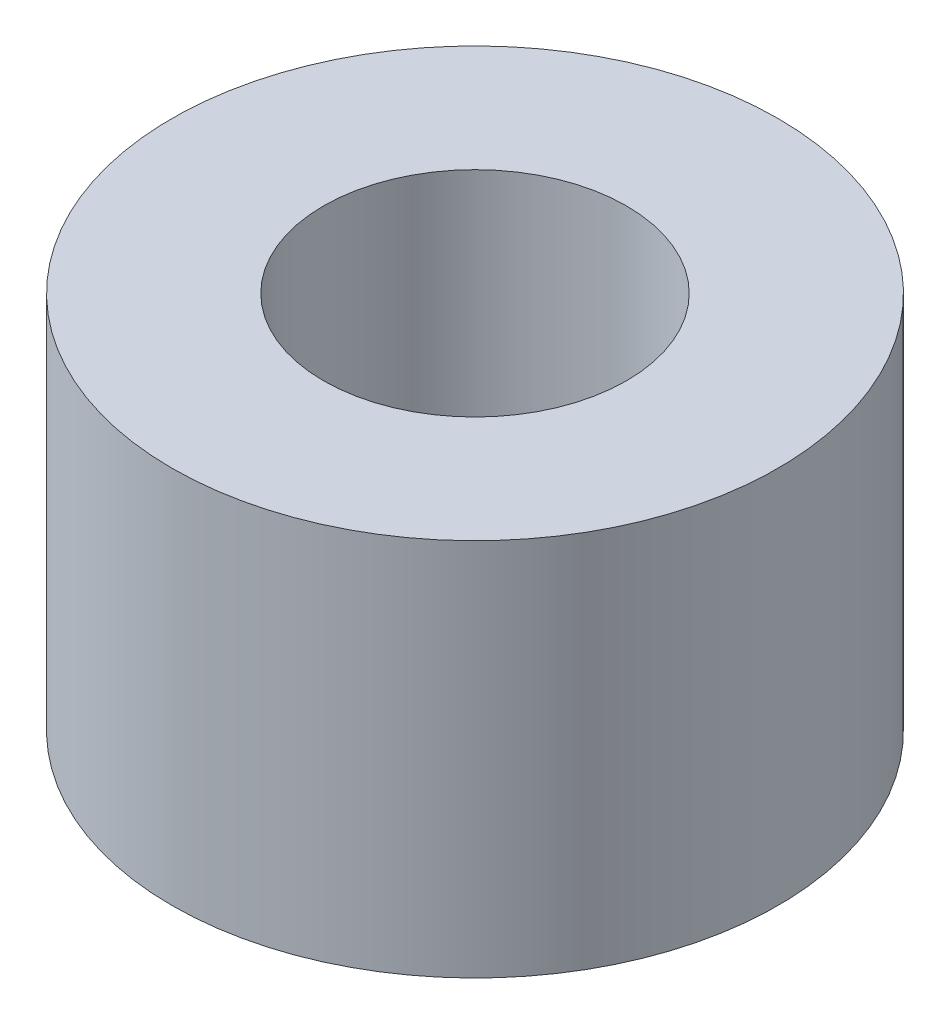
ISO-10303-21;
HEADER;
FILE_DESCRIPTION(('STEP AP214'),'2;1');
FILE_NAME('part.step','',(''),(''),'','','');
FILE_SCHEMA(('AUTOMOTIVE_DESIGN { 1 0 10303 214 1 1 1 1 }'));
ENDSEC;
DATA;
#1=APPLICATION_CONTEXT('core data for automotive mechanical design processes');
#2=APPLICATION_PROTOCOL_DEFINITION('international standard','automotive_design',2000,#1);
#3=PRODUCT_CONTEXT('',#1,'mechanical');
#4=PRODUCT('Part','Part','',(#3));
#5=PRODUCT_RELATED_PRODUCT_CATEGORY('part','',(#4));
#6=PRODUCT_DEFINITION_FORMATION('','',#4);
#7=PRODUCT_DEFINITION_CONTEXT('part definition',#1,'design');
#8=PRODUCT_DEFINITION('design','',#6,#7);
#9=PRODUCT_DEFINITION_SHAPE('','',#8);
#10=(LENGTH_UNIT() NAMED_UNIT(*) SI_UNIT(.MILLI.,.METRE.));
#11=(NAMED_UNIT(*) PLANE_ANGLE_UNIT() SI_UNIT($,.RADIAN.));
#12=(NAMED_UNIT(*) SI_UNIT($,.STERADIAN.) SOLID_ANGLE_UNIT());
#13=UNCERTAINTY_MEASURE_WITH_UNIT(LENGTH_MEASURE(1.E-05),#10,'distance_accuracy_value','');
#14=(GEOMETRIC_REPRESENTATION_CONTEXT(3) GLOBAL_UNCERTAINTY_ASSIGNED_CONTEXT((#13)) GLOBAL_UNIT_ASSIGNED_CONTEXT((#10,
#11,#12)) REPRESENTATION_CONTEXT('',''));
#15=CARTESIAN_POINT('',(0.,0.,0.));
#16=DIRECTION('',(0.,0.,1.));
#17=DIRECTION('',(1.,0.,0.));
#18=AXIS2_PLACEMENT_3D('',#15,#16,#17);
#19=CARTESIAN_POINT('',(0.,5.,0.));
#20=DIRECTION('',(0.,1.,0.));
#21=DIRECTION('',(0.,0.,1.));
#22=AXIS2_PLACEMENT_3D('',#19,#20,#21);
#23=PLANE('',#22);
#24=CARTESIAN_POINT('',(0.,5.,0.));
#25=DIRECTION('',(0.,1.,0.));
#26=DIRECTION('',(0.,0.,1.));
#27=AXIS2_PLACEMENT_3D('',#24,#25,#26);
#28=CIRCLE('',#27,4.);
#29=CARTESIAN_POINT('',(0.,5.,4.));
#30=VERTEX_POINT('',#29);
#31=EDGE_CURVE('E10',#30,#30,#28,.T.);
#32=ORIENTED_EDGE('',*,*,#31,.T.);
#33=EDGE_LOOP('',(#32));
#34=FACE_BOUND('',#33,.T.);
#35=CARTESIAN_POINT('',(0.,5.,0.));
#36=DIRECTION('',(0.,1.,0.));
#37=DIRECTION('',(0.,0.,1.));
#38=AXIS2_PLACEMENT_3D('',#35,#36,#37);
#39=CIRCLE('',#38,2.);
#40=CARTESIAN_POINT('',(0.,5.,2.));
#41=VERTEX_POINT('',#40);
#42=EDGE_CURVE('E42',#41,#41,#39,.T.);
#43=ORIENTED_EDGE('',*,*,#42,.F.);
#44=EDGE_LOOP('',(#43));
#45=FACE_BOUND('',#44,.T.);
#46=ADVANCED_FACE('F31',(#34,#45),#23,.T.);
#47=CARTESIAN_POINT('',(0.,0.,0.));
#48=DIRECTION('',(0.,1.,0.));
#49=DIRECTION('',(0.,0.,1.));
#50=AXIS2_PLACEMENT_3D('',#47,#48,#49);
#51=PLANE('',#50);
#52=CARTESIAN_POINT('',(0.,0.,0.));
#53=DIRECTION('',(0.,1.,0.));
#54=DIRECTION('',(0.,0.,1.));
#55=AXIS2_PLACEMENT_3D('',#52,#53,#54);
#56=CIRCLE('',#55,4.);
#57=CARTESIAN_POINT('',(0.,0.,4.));
#58=VERTEX_POINT('',#57);
#59=EDGE_CURVE('E35',#58,#58,#56,.T.);
#60=ORIENTED_EDGE('',*,*,#59,.F.);
#61=EDGE_LOOP('',(#60));
#62=FACE_BOUND('',#61,.T.);
#63=CARTESIAN_POINT('',(0.,0.,0.));
#64=DIRECTION('',(0.,1.,0.));
#65=DIRECTION('',(0.,0.,1.));
#66=AXIS2_PLACEMENT_3D('',#63,#64,#65);
#67=CIRCLE('',#66,2.);
#68=CARTESIAN_POINT('',(0.,0.,2.));
#69=VERTEX_POINT('',#68);
#70=EDGE_CURVE('E44',#69,#69,#67,.T.);
#71=ORIENTED_EDGE('',*,*,#70,.T.);
#72=EDGE_LOOP('',(#71));
#73=FACE_BOUND('',#72,.T.);
#74=ADVANCED_FACE('F54',(#62,#73),#51,.F.);
#75=CARTESIAN_POINT('',(0.,5.,0.));
#76=DIRECTION('',(0.,-1.,0.));
#77=DIRECTION('',(0.,0.,-1.));
#78=AXIS2_PLACEMENT_3D('',#75,#76,#77);
#79=CYLINDRICAL_SURFACE('',#78,4.);
#80=ORIENTED_EDGE('',*,*,#31,.F.);
#81=EDGE_LOOP('',(#80));
#82=FACE_BOUND('',#81,.T.);
#83=ORIENTED_EDGE('',*,*,#59,.T.);
#84=EDGE_LOOP('',(#83));
#85=FACE_BOUND('',#84,.T.);
#86=ADVANCED_FACE('F33',(#82,#85),#79,.T.);
#87=CARTESIAN_POINT('',(0.,5.,0.));
#88=DIRECTION('',(0.,-1.,0.));
#89=DIRECTION('',(0.,0.,-1.));
#90=AXIS2_PLACEMENT_3D('',#87,#88,#89);
#91=CYLINDRICAL_SURFACE('',#90,2.);
#92=ORIENTED_EDGE('',*,*,#42,.T.);
#93=EDGE_LOOP('',(#92));
#94=FACE_BOUND('',#93,.T.);
#95=ORIENTED_EDGE('',*,*,#70,.F.);
#96=EDGE_LOOP('',(#95));
#97=FACE_BOUND('',#96,.T.);
#98=ADVANCED_FACE('F50',(#94,#97),#91,.F.);
#99=CLOSED_SHELL('',(#46,#74,#86,#98));
#100=MANIFOLD_SOLID_BREP('B2',#99);
#101=ADVANCED_BREP_SHAPE_REPRESENTATION('',(#18,#100),#14);
#102=SHAPE_DEFINITION_REPRESENTATION(#9,#101);
ENDSEC;
END-ISO-10303-21;
